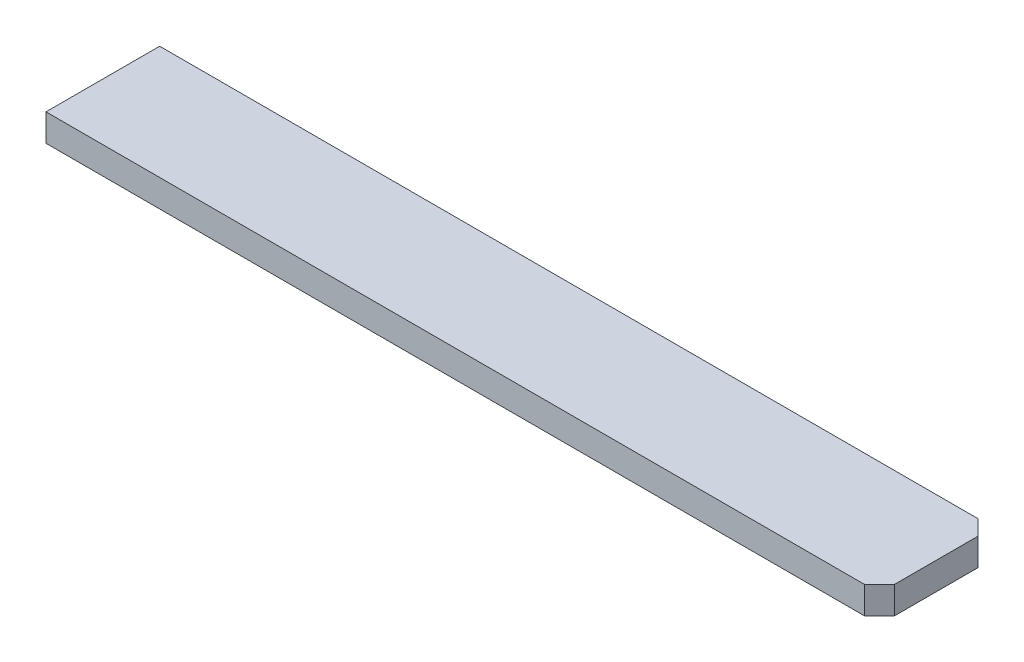
ISO-10303-21;
HEADER;
FILE_DESCRIPTION(('STEP AP214'),'2;1');
FILE_NAME('part.step','',(''),(''),'','','');
FILE_SCHEMA(('AUTOMOTIVE_DESIGN { 1 0 10303 214 1 1 1 1 }'));
ENDSEC;
DATA;
#1=APPLICATION_CONTEXT('core data for automotive mechanical design processes');
#2=APPLICATION_PROTOCOL_DEFINITION('international standard','automotive_design',2000,#1);
#3=PRODUCT_CONTEXT('',#1,'mechanical');
#4=PRODUCT('Part','Part','',(#3));
#5=PRODUCT_RELATED_PRODUCT_CATEGORY('part','',(#4));
#6=PRODUCT_DEFINITION_FORMATION('','',#4);
#7=PRODUCT_DEFINITION_CONTEXT('part definition',#1,'design');
#8=PRODUCT_DEFINITION('design','',#6,#7);
#9=PRODUCT_DEFINITION_SHAPE('','',#8);
#10=(LENGTH_UNIT() NAMED_UNIT(*) SI_UNIT(.MILLI.,.METRE.));
#11=(NAMED_UNIT(*) PLANE_ANGLE_UNIT() SI_UNIT($,.RADIAN.));
#12=(NAMED_UNIT(*) SI_UNIT($,.STERADIAN.) SOLID_ANGLE_UNIT());
#13=UNCERTAINTY_MEASURE_WITH_UNIT(LENGTH_MEASURE(1.E-05),#10,'distance_accuracy_value','');
#14=(GEOMETRIC_REPRESENTATION_CONTEXT(3) GLOBAL_UNCERTAINTY_ASSIGNED_CONTEXT((#13)) GLOBAL_UNIT_ASSIGNED_CONTEXT((#10,
#11,#12)) REPRESENTATION_CONTEXT('',''));
#15=CARTESIAN_POINT('',(0.,0.,0.));
#16=DIRECTION('',(0.,0.,1.));
#17=DIRECTION('',(1.,0.,0.));
#18=AXIS2_PLACEMENT_3D('',#15,#16,#17);
#19=CARTESIAN_POINT('',(-18.,0.,37.5));
#20=DIRECTION('',(1.,0.,0.));
#21=DIRECTION('',(0.,1.,0.));
#22=AXIS2_PLACEMENT_3D('',#19,#20,#21);
#23=PLANE('',#22);
#24=DIRECTION('',(0.,-1.,0.));
#25=VECTOR('',#24,1.);
#26=CARTESIAN_POINT('',(-18.,0.,-37.5));
#27=LINE('',#26,#25);
#28=CARTESIAN_POINT('',(-18.,18.,-37.5));
#29=VERTEX_POINT('',#28);
#30=CARTESIAN_POINT('',(-18.,0.,-37.5));
#31=VERTEX_POINT('',#30);
#32=EDGE_CURVE('E108',#29,#31,#27,.T.);
#33=ORIENTED_EDGE('',*,*,#32,.T.);
#34=DIRECTION('',(0.,0.,-1.));
#35=VECTOR('',#34,1.);
#36=CARTESIAN_POINT('',(-18.,0.,37.5));
#37=LINE('',#36,#35);
#38=CARTESIAN_POINT('',(-18.,0.,37.5));
#39=VERTEX_POINT('',#38);
#40=EDGE_CURVE('E89',#39,#31,#37,.T.);
#41=ORIENTED_EDGE('',*,*,#40,.F.);
#42=DIRECTION('',(0.,-1.,0.));
#43=VECTOR('',#42,1.);
#44=CARTESIAN_POINT('',(-18.,0.,37.5));
#45=LINE('',#44,#43);
#46=CARTESIAN_POINT('',(-18.,18.,37.5));
#47=VERTEX_POINT('',#46);
#48=EDGE_CURVE('E96',#47,#39,#45,.T.);
#49=ORIENTED_EDGE('',*,*,#48,.F.);
#50=DIRECTION('',(0.,0.,-1.));
#51=VECTOR('',#50,1.);
#52=CARTESIAN_POINT('',(-18.,18.,37.5));
#53=LINE('',#52,#51);
#54=EDGE_CURVE('E136',#47,#29,#53,.T.);
#55=ORIENTED_EDGE('',*,*,#54,.T.);
#56=EDGE_LOOP('',(#33,#41,#49,#55));
#57=FACE_BOUND('',#56,.T.);
#58=CARTESIAN_POINT('',(-18.,9.,0.));
#59=DIRECTION('',(1.,0.,0.));
#60=DIRECTION('',(0.,1.,0.));
#61=AXIS2_PLACEMENT_3D('',#58,#59,#60);
#62=CIRCLE('',#61,2.);
#63=CARTESIAN_POINT('',(-18.,11.,0.));
#64=VERTEX_POINT('',#63);
#65=EDGE_CURVE('E176',#64,#64,#62,.T.);
#66=ORIENTED_EDGE('',*,*,#65,.T.);
#67=EDGE_LOOP('',(#66));
#68=FACE_BOUND('',#67,.T.);
#69=ADVANCED_FACE('F33',(#57,#68),#23,.F.);
#70=CARTESIAN_POINT('',(-18.,0.,37.5));
#71=DIRECTION('',(0.,1.,0.));
#72=DIRECTION('',(0.,0.,1.));
#73=AXIS2_PLACEMENT_3D('',#70,#71,#72);
#74=PLANE('',#73);
#75=DIRECTION('',(0.,0.,-1.));
#76=VECTOR('',#75,1.);
#77=CARTESIAN_POINT('',(532.,0.,37.5));
#78=LINE('',#77,#76);
#79=CARTESIAN_POINT('',(532.,0.,27.5));
#80=VERTEX_POINT('',#79);
#81=CARTESIAN_POINT('',(532.,0.,-27.5));
#82=VERTEX_POINT('',#81);
#83=EDGE_CURVE('E110',#80,#82,#78,.T.);
#84=ORIENTED_EDGE('',*,*,#83,.F.);
#85=DIRECTION('',(0.707106781186549,0.,-0.707106781186546));
#86=VECTOR('',#85,1.);
#87=CARTESIAN_POINT('',(522.,0.,37.5));
#88=LINE('',#87,#86);
#89=CARTESIAN_POINT('',(522.,0.,37.5));
#90=VERTEX_POINT('',#89);
#91=EDGE_CURVE('E41',#80,#90,#88,.F.);
#92=ORIENTED_EDGE('',*,*,#91,.T.);
#93=DIRECTION('',(1.,0.,0.));
#94=VECTOR('',#93,1.);
#95=CARTESIAN_POINT('',(-18.,0.,37.5));
#96=LINE('',#95,#94);
#97=EDGE_CURVE('E85',#39,#90,#96,.T.);
#98=ORIENTED_EDGE('',*,*,#97,.F.);
#99=ORIENTED_EDGE('',*,*,#40,.T.);
#100=DIRECTION('',(1.,0.,0.));
#101=VECTOR('',#100,1.);
#102=CARTESIAN_POINT('',(-18.,0.,-37.5));
#103=LINE('',#102,#101);
#104=CARTESIAN_POINT('',(522.,0.,-37.5));
#105=VERTEX_POINT('',#104);
#106=EDGE_CURVE('E141',#31,#105,#103,.T.);
#107=ORIENTED_EDGE('',*,*,#106,.T.);
#108=DIRECTION('',(0.707106781186549,0.,0.707106781186546));
#109=VECTOR('',#108,1.);
#110=CARTESIAN_POINT('',(532.,0.,-27.5));
#111=LINE('',#110,#109);
#112=EDGE_CURVE('E53',#105,#82,#111,.T.);
#113=ORIENTED_EDGE('',*,*,#112,.T.);
#114=EDGE_LOOP('',(#84,#92,#98,#99,#107,#113));
#115=FACE_BOUND('',#114,.T.);
#116=ADVANCED_FACE('F87',(#115),#74,.F.);
#117=CARTESIAN_POINT('',(532.,0.,37.5));
#118=DIRECTION('',(-1.,0.,0.));
#119=DIRECTION('',(0.,0.,1.));
#120=AXIS2_PLACEMENT_3D('',#117,#118,#119);
#121=PLANE('',#120);
#122=DIRECTION('',(0.,0.,-1.));
#123=VECTOR('',#122,1.);
#124=CARTESIAN_POINT('',(532.,18.,37.5));
#125=LINE('',#124,#123);
#126=CARTESIAN_POINT('',(532.,18.,27.5));
#127=VERTEX_POINT('',#126);
#128=CARTESIAN_POINT('',(532.,18.,-27.5));
#129=VERTEX_POINT('',#128);
#130=EDGE_CURVE('E114',#127,#129,#125,.T.);
#131=ORIENTED_EDGE('',*,*,#130,.F.);
#132=DIRECTION('',(0.,-1.,0.));
#133=VECTOR('',#132,1.);
#134=CARTESIAN_POINT('',(532.,0.,27.5));
#135=LINE('',#134,#133);
#136=EDGE_CURVE('E124',#127,#80,#135,.T.);
#137=ORIENTED_EDGE('',*,*,#136,.T.);
#138=ORIENTED_EDGE('',*,*,#83,.T.);
#139=DIRECTION('',(0.,1.,0.));
#140=VECTOR('',#139,1.);
#141=CARTESIAN_POINT('',(532.,18.,-27.5));
#142=LINE('',#141,#140);
#143=EDGE_CURVE('E121',#82,#129,#142,.T.);
#144=ORIENTED_EDGE('',*,*,#143,.T.);
#145=EDGE_LOOP('',(#131,#137,#138,#144));
#146=FACE_BOUND('',#145,.T.);
#147=ADVANCED_FACE('F129',(#146),#121,.F.);
#148=CARTESIAN_POINT('',(-18.,18.,37.5));
#149=DIRECTION('',(0.,-1.,0.));
#150=DIRECTION('',(0.,0.,-1.));
#151=AXIS2_PLACEMENT_3D('',#148,#149,#150);
#152=PLANE('',#151);
#153=DIRECTION('',(-1.,0.,0.));
#154=VECTOR('',#153,1.);
#155=CARTESIAN_POINT('',(-18.,18.,37.5));
#156=LINE('',#155,#154);
#157=CARTESIAN_POINT('',(522.,18.,37.5));
#158=VERTEX_POINT('',#157);
#159=EDGE_CURVE('E95',#158,#47,#156,.T.);
#160=ORIENTED_EDGE('',*,*,#159,.F.);
#161=DIRECTION('',(-0.707106781186549,0.,0.707106781186546));
#162=VECTOR('',#161,1.);
#163=CARTESIAN_POINT('',(522.,18.,37.5));
#164=LINE('',#163,#162);
#165=EDGE_CURVE('E119',#158,#127,#164,.F.);
#166=ORIENTED_EDGE('',*,*,#165,.T.);
#167=ORIENTED_EDGE('',*,*,#130,.T.);
#168=DIRECTION('',(-0.707106781186549,0.,-0.707106781186546));
#169=VECTOR('',#168,1.);
#170=CARTESIAN_POINT('',(532.,18.,-27.5));
#171=LINE('',#170,#169);
#172=CARTESIAN_POINT('',(522.,18.,-37.5));
#173=VERTEX_POINT('',#172);
#174=EDGE_CURVE('E112',#129,#173,#171,.T.);
#175=ORIENTED_EDGE('',*,*,#174,.T.);
#176=DIRECTION('',(-1.,0.,0.));
#177=VECTOR('',#176,1.);
#178=CARTESIAN_POINT('',(-18.,18.,-37.5));
#179=LINE('',#178,#177);
#180=EDGE_CURVE('E104',#173,#29,#179,.T.);
#181=ORIENTED_EDGE('',*,*,#180,.T.);
#182=ORIENTED_EDGE('',*,*,#54,.F.);
#183=EDGE_LOOP('',(#160,#166,#167,#175,#181,#182));
#184=FACE_BOUND('',#183,.T.);
#185=ADVANCED_FACE('F135',(#184),#152,.F.);
#186=CARTESIAN_POINT('',(-18.,18.,37.5));
#187=DIRECTION('',(0.,0.,-1.));
#188=DIRECTION('',(-1.,0.,0.));
#189=AXIS2_PLACEMENT_3D('',#186,#187,#188);
#190=PLANE('',#189);
#191=ORIENTED_EDGE('',*,*,#97,.T.);
#192=DIRECTION('',(0.,1.,0.));
#193=VECTOR('',#192,1.);
#194=CARTESIAN_POINT('',(522.,18.,37.5));
#195=LINE('',#194,#193);
#196=EDGE_CURVE('E109',#90,#158,#195,.T.);
#197=ORIENTED_EDGE('',*,*,#196,.T.);
#198=ORIENTED_EDGE('',*,*,#159,.T.);
#199=ORIENTED_EDGE('',*,*,#48,.T.);
#200=EDGE_LOOP('',(#191,#197,#198,#199));
#201=FACE_BOUND('',#200,.T.);
#202=ADVANCED_FACE('F99',(#201),#190,.F.);
#203=CARTESIAN_POINT('',(-18.,18.,-37.5));
#204=DIRECTION('',(0.,0.,-1.));
#205=DIRECTION('',(-1.,0.,0.));
#206=AXIS2_PLACEMENT_3D('',#203,#204,#205);
#207=PLANE('',#206);
#208=ORIENTED_EDGE('',*,*,#180,.F.);
#209=DIRECTION('',(0.,-1.,0.));
#210=VECTOR('',#209,1.);
#211=CARTESIAN_POINT('',(522.,0.,-37.5));
#212=LINE('',#211,#210);
#213=EDGE_CURVE('E11',#173,#105,#212,.T.);
#214=ORIENTED_EDGE('',*,*,#213,.T.);
#215=ORIENTED_EDGE('',*,*,#106,.F.);
#216=ORIENTED_EDGE('',*,*,#32,.F.);
#217=EDGE_LOOP('',(#208,#214,#215,#216));
#218=FACE_BOUND('',#217,.T.);
#219=ADVANCED_FACE('F145',(#218),#207,.T.);
#220=CARTESIAN_POINT('',(522.,18.,37.5));
#221=DIRECTION('',(-0.707106781186546,0.,-0.707106781186549));
#222=DIRECTION('',(-0.707106781186549,0.,0.707106781186546));
#223=AXIS2_PLACEMENT_3D('',#220,#221,#222);
#224=PLANE('',#223);
#225=ORIENTED_EDGE('',*,*,#91,.F.);
#226=ORIENTED_EDGE('',*,*,#136,.F.);
#227=ORIENTED_EDGE('',*,*,#165,.F.);
#228=ORIENTED_EDGE('',*,*,#196,.F.);
#229=EDGE_LOOP('',(#225,#226,#227,#228));
#230=FACE_BOUND('',#229,.T.);
#231=ADVANCED_FACE('F133',(#230),#224,.F.);
#232=CARTESIAN_POINT('',(532.,0.,-27.5));
#233=DIRECTION('',(0.707106781186546,0.,-0.707106781186549));
#234=DIRECTION('',(-0.707106781186549,0.,-0.707106781186546));
#235=AXIS2_PLACEMENT_3D('',#232,#233,#234);
#236=PLANE('',#235);
#237=ORIENTED_EDGE('',*,*,#112,.F.);
#238=ORIENTED_EDGE('',*,*,#213,.F.);
#239=ORIENTED_EDGE('',*,*,#174,.F.);
#240=ORIENTED_EDGE('',*,*,#143,.F.);
#241=EDGE_LOOP('',(#237,#238,#239,#240));
#242=FACE_BOUND('',#241,.T.);
#243=ADVANCED_FACE('F35',(#242),#236,.T.);
#244=CARTESIAN_POINT('',(17.,9.,0.));
#245=DIRECTION('',(-1.,0.,0.));
#246=DIRECTION('',(0.,-1.,0.));
#247=AXIS2_PLACEMENT_3D('',#244,#245,#246);
#248=CYLINDRICAL_SURFACE('',#247,2.);
#249=CARTESIAN_POINT('',(17.,9.,0.));
#250=DIRECTION('',(1.,0.,0.));
#251=DIRECTION('',(0.,1.,0.));
#252=AXIS2_PLACEMENT_3D('',#249,#250,#251);
#253=CIRCLE('',#252,2.);
#254=CARTESIAN_POINT('',(17.,11.,0.));
#255=VERTEX_POINT('',#254);
#256=EDGE_CURVE('E142',#255,#255,#253,.T.);
#257=ORIENTED_EDGE('',*,*,#256,.T.);
#258=EDGE_LOOP('',(#257));
#259=FACE_BOUND('',#258,.T.);
#260=ORIENTED_EDGE('',*,*,#65,.F.);
#261=EDGE_LOOP('',(#260));
#262=FACE_BOUND('',#261,.T.);
#263=ADVANCED_FACE('F147',(#259,#262),#248,.F.);
#264=CARTESIAN_POINT('',(17.,9.,0.));
#265=DIRECTION('',(1.,0.,0.));
#266=DIRECTION('',(0.,1.,0.));
#267=AXIS2_PLACEMENT_3D('',#264,#265,#266);
#268=PLANE('',#267);
#269=ORIENTED_EDGE('',*,*,#256,.F.);
#270=EDGE_LOOP('',(#269));
#271=FACE_BOUND('',#270,.T.);
#272=ADVANCED_FACE('F152',(#271),#268,.F.);
#273=CLOSED_SHELL('',(#69,#116,#147,#185,#202,#219,#231,#243,#263,#272));
#274=MANIFOLD_SOLID_BREP('B2',#273);
#275=ADVANCED_BREP_SHAPE_REPRESENTATION('',(#18,#274),#14);
#276=SHAPE_DEFINITION_REPRESENTATION(#9,#275);
ENDSEC;
END-ISO-10303-21;
